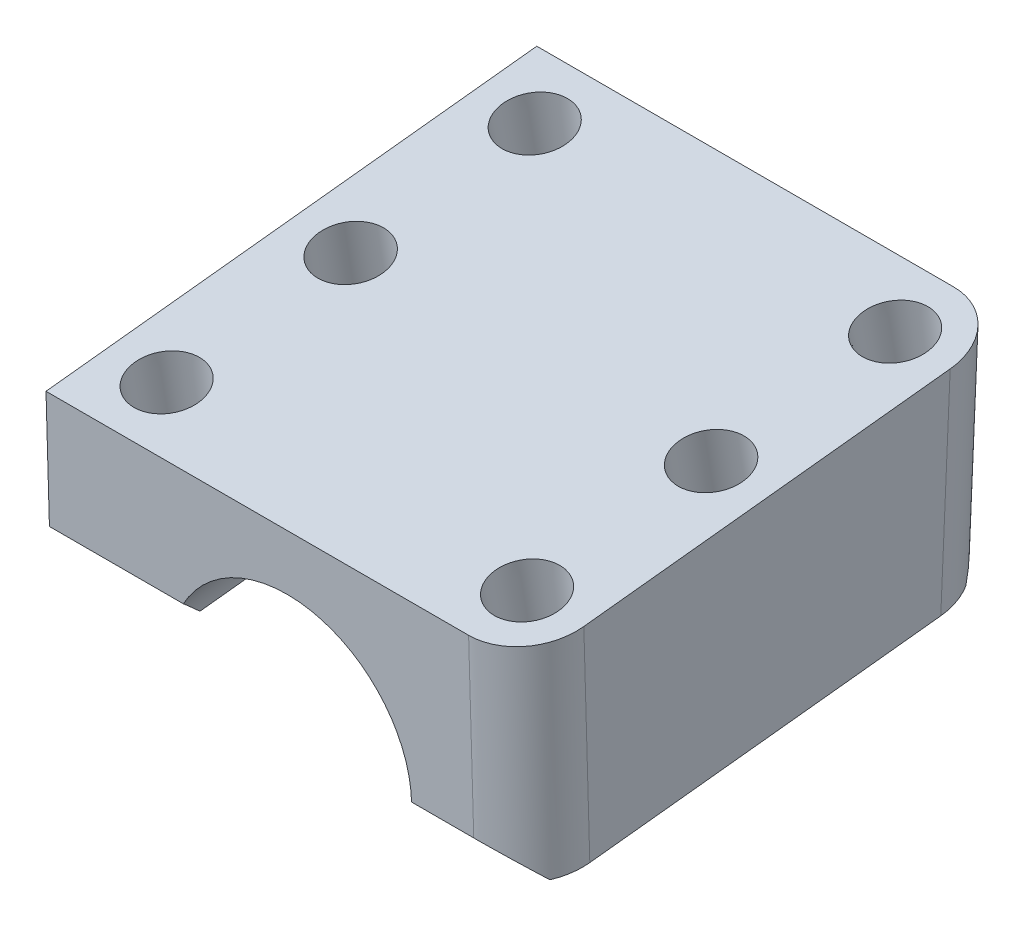
ISO-10303-21;
HEADER;
FILE_DESCRIPTION(('STEP AP214'),'2;1');
FILE_NAME('part.step','',(''),(''),'','','');
FILE_SCHEMA(('AUTOMOTIVE_DESIGN { 1 0 10303 214 1 1 1 1 }'));
ENDSEC;
DATA;
#1=APPLICATION_CONTEXT('core data for automotive mechanical design processes');
#2=APPLICATION_PROTOCOL_DEFINITION('international standard','automotive_design',2000,#1);
#3=PRODUCT_CONTEXT('',#1,'mechanical');
#4=PRODUCT('Part','Part','',(#3));
#5=PRODUCT_RELATED_PRODUCT_CATEGORY('part','',(#4));
#6=PRODUCT_DEFINITION_FORMATION('','',#4);
#7=PRODUCT_DEFINITION_CONTEXT('part definition',#1,'design');
#8=PRODUCT_DEFINITION('design','',#6,#7);
#9=PRODUCT_DEFINITION_SHAPE('','',#8);
#10=(LENGTH_UNIT() NAMED_UNIT(*) SI_UNIT(.MILLI.,.METRE.));
#11=(NAMED_UNIT(*) PLANE_ANGLE_UNIT() SI_UNIT($,.RADIAN.));
#12=(NAMED_UNIT(*) SI_UNIT($,.STERADIAN.) SOLID_ANGLE_UNIT());
#13=UNCERTAINTY_MEASURE_WITH_UNIT(LENGTH_MEASURE(1.E-05),#10,'distance_accuracy_value','');
#14=(GEOMETRIC_REPRESENTATION_CONTEXT(3) GLOBAL_UNCERTAINTY_ASSIGNED_CONTEXT((#13)) GLOBAL_UNIT_ASSIGNED_CONTEXT((#10,
#11,#12)) REPRESENTATION_CONTEXT('',''));
#15=CARTESIAN_POINT('',(0.,0.,0.));
#16=DIRECTION('',(0.,0.,1.));
#17=DIRECTION('',(1.,0.,0.));
#18=AXIS2_PLACEMENT_3D('',#15,#16,#17);
#19=CARTESIAN_POINT('',(188.153502405268,447.846631347327,1342.84881107068));
#20=DIRECTION('',(0.,0.0348994967025017,-0.999390827019096));
#21=DIRECTION('',(0.,0.999390827019096,0.0348994967025017));
#22=AXIS2_PLACEMENT_3D('',#19,#20,#21);
#23=PLANE('',#22);
#24=DIRECTION('',(0.00629717899452653,0.999371011669221,0.0348988047352322));
#25=VECTOR('',#24,1.);
#26=CARTESIAN_POINT('',(2706.7408835814,398347.018009544,15237.7940557248));
#27=LINE('',#26,#25);
#28=CARTESIAN_POINT('',(199.43978468566,434.867514734833,1342.39557033125));
#29=VERTEX_POINT('',#28);
#30=CARTESIAN_POINT('',(199.439949562137,434.893680859602,1342.39648407246));
#31=VERTEX_POINT('',#30);
#32=EDGE_CURVE('E168',#29,#31,#27,.T.);
#33=ORIENTED_EDGE('',*,*,#32,.F.);
#34=DIRECTION('',(1.,0.,0.));
#35=VECTOR('',#34,1.);
#36=CARTESIAN_POINT('',(188.153502405268,434.867514734738,1342.39557033124));
#37=LINE('',#36,#35);
#38=CARTESIAN_POINT('',(206.108243412971,434.867514734738,1342.39557033124));
#39=VERTEX_POINT('',#38);
#40=EDGE_CURVE('E59',#29,#39,#37,.T.);
#41=ORIENTED_EDGE('',*,*,#40,.T.);
#42=DIRECTION('',(-0.00629717899449076,-0.999371011669222,-0.0348988047352363));
#43=VECTOR('',#42,1.);
#44=CARTESIAN_POINT('',(206.189311445498,447.733123565572,1342.84484729159));
#45=LINE('',#44,#43);
#46=CARTESIAN_POINT('',(206.229361186729,454.089072862483,1343.0668019319));
#47=VERTEX_POINT('',#46);
#48=EDGE_CURVE('E166',#39,#47,#45,.F.);
#49=ORIENTED_EDGE('',*,*,#48,.T.);
#50=DIRECTION('',(1.,0.,0.));
#51=VECTOR('',#50,1.);
#52=CARTESIAN_POINT('',(-291599.140282778,454.089072858892,1343.06680193177));
#53=LINE('',#52,#51);
#54=CARTESIAN_POINT('',(160.905940247176,454.089072862483,1343.0668019319));
#55=VERTEX_POINT('',#54);
#56=EDGE_CURVE('E151',#55,#47,#53,.T.);
#57=ORIENTED_EDGE('',*,*,#56,.F.);
#58=DIRECTION('',(0.0062971789944939,0.999371011669221,0.0348988047352322));
#59=VECTOR('',#58,1.);
#60=CARTESIAN_POINT('',(2668.08745419803,398347.261273663,15237.802550695));
#61=LINE('',#60,#59);
#62=CARTESIAN_POINT('',(160.825140105862,441.265978735771,1342.61900961773));
#63=VERTEX_POINT('',#62);
#64=EDGE_CURVE('E143',#63,#55,#61,.T.);
#65=ORIENTED_EDGE('',*,*,#64,.F.);
#66=DIRECTION('',(1.,0.,0.));
#67=VECTOR('',#66,1.);
#68=CARTESIAN_POINT('',(188.153502405267,441.265978735739,1342.61900961772));
#69=LINE('',#68,#67);
#70=CARTESIAN_POINT('',(175.191164076687,441.265978735739,1342.61900961772));
#71=VERTEX_POINT('',#70);
#72=EDGE_CURVE('E268',#63,#71,#69,.T.);
#73=ORIENTED_EDGE('',*,*,#72,.T.);
#74=CARTESIAN_POINT('',(199.439949562144,434.893680859499,1342.39648407245));
#75=CARTESIAN_POINT('',(199.57085433581,455.668449403813,1343.12195497603));
#76=CARTESIAN_POINT('',(179.102540325545,458.234015619484,1343.21154652247));
#77=CARTESIAN_POINT('',(173.916193918006,438.092912859984,1342.50820371569));
#78=(BOUNDED_CURVE() B_SPLINE_CURVE(3,(#74,#75,#76,#77),.UNSPECIFIED.,.F.,
.F.) B_SPLINE_CURVE_WITH_KNOTS((4,4),(0.,1.),
.UNSPECIFIED.) CURVE() GEOMETRIC_REPRESENTATION_ITEM() RATIONAL_B_SPLINE_CURVE((1.,
0.415662889663478,0.415662889663478,1.)) REPRESENTATION_ITEM(''));
#79=EDGE_CURVE('E152',#31,#71,#78,.T.);
#80=ORIENTED_EDGE('',*,*,#79,.F.);
#81=EDGE_LOOP('',(#33,#41,#49,#57,#65,#73,#80));
#82=FACE_BOUND('',#81,.T.);
#83=ADVANCED_FACE('F49',(#82),#23,.F.);
#84=CARTESIAN_POINT('',(2712.09945337347,398364.6313612,15130.6226598834));
#85=DIRECTION('',(0.9987850922731,-0.00799153965599361,0.0486258649994229));
#86=DIRECTION('',(0.0486274178120887,0.,-0.99881698735901));
#87=AXIS2_PLACEMENT_3D('',#84,#85,#86);
#88=PLANE('',#87);
#89=DIRECTION('',(-0.0492781843518552,-0.16197493429726,0.985563687037212));
#90=VECTOR('',#89,1.);
#91=CARTESIAN_POINT('',(204.798519354205,452.507032516395,1235.22508823109));
#92=LINE('',#91,#90);
#93=CARTESIAN_POINT('',(201.847512364153,442.807219716647,1294.24522803215));
#94=VERTEX_POINT('',#93);
#95=EDGE_CURVE('E173',#94,#31,#92,.T.);
#96=ORIENTED_EDGE('',*,*,#95,.F.);
#97=DIRECTION('',(0.0348661114371685,0.811925398147656,-0.582719059338222));
#98=VECTOR('',#97,1.);
#99=CARTESIAN_POINT('',(-153.029055507488,-7821.18571742755,7225.31500574418));
#100=LINE('',#99,#98);
#101=CARTESIAN_POINT('',(201.690863815295,439.159352772088,1296.86330304179));
#102=VERTEX_POINT('',#101);
#103=EDGE_CURVE('E253',#94,#102,#100,.F.);
#104=ORIENTED_EDGE('',*,*,#103,.T.);
#105=DIRECTION('',(-0.0492781843518552,-0.16197493429726,0.985563687037212));
#106=VECTOR('',#105,1.);
#107=CARTESIAN_POINT('',(204.778360537992,449.307800515841,1235.11336858785));
#108=LINE('',#107,#106);
#109=CARTESIAN_POINT('',(199.559723392072,432.154400488027,1339.48611150627));
#110=VERTEX_POINT('',#109);
#111=EDGE_CURVE('E180',#102,#110,#108,.T.);
#112=ORIENTED_EDGE('',*,*,#111,.T.);
#113=DIRECTION('',(0.0301354248410263,-0.681688613421351,-0.731021539013268));
#114=VECTOR('',#113,1.);
#115=CARTESIAN_POINT('',(-65.4305993702451,6426.45800320402,7767.58973344807));
#116=LINE('',#115,#114);
#117=EDGE_CURVE('E251',#110,#29,#116,.F.);
#118=ORIENTED_EDGE('',*,*,#117,.T.);
#119=ORIENTED_EDGE('',*,*,#32,.T.);
#120=EDGE_LOOP('',(#96,#104,#112,#118,#119));
#121=FACE_BOUND('',#120,.T.);
#122=ADVANCED_FACE('F363',(#121),#88,.F.);
#123=CARTESIAN_POINT('',(-291593.781712988,449.307800513795,1235.11336858778));
#124=DIRECTION('',(0.,0.986762512438188,0.16217195826244));
#125=DIRECTION('',(0.,-0.16217195826244,0.986762512438188));
#126=AXIS2_PLACEMENT_3D('',#123,#124,#125);
#127=PLANE('',#126);
#128=CARTESIAN_POINT('',(207.171814898282,436.277443763342,1314.39876234358));
#129=DIRECTION('',(0.,0.986762512438188,0.16217195826244));
#130=DIRECTION('',(0.,-0.16217195826244,0.986762512438188));
#131=AXIS2_PLACEMENT_3D('',#128,#129,#130);
#132=CIRCLE('',#131,3.57123999999999);
#133=CARTESIAN_POINT('',(207.171814898282,435.698288779116,1317.9227280985));
#134=VERTEX_POINT('',#133);
#135=EDGE_CURVE('E275',#134,#134,#132,.T.);
#136=ORIENTED_EDGE('',*,*,#135,.T.);
#137=EDGE_LOOP('',(#136));
#138=FACE_BOUND('',#137,.T.);
#139=ORIENTED_EDGE('',*,*,#111,.F.);
#140=DIRECTION('',(1.,0.,0.));
#141=VECTOR('',#140,1.);
#142=CARTESIAN_POINT('',(-291593.781712988,439.159352770022,1296.86330304184));
#143=LINE('',#142,#141);
#144=CARTESIAN_POINT('',(213.355307167909,439.159352772008,1296.86330304178));
#145=VERTEX_POINT('',#144);
#146=EDGE_CURVE('E229',#102,#145,#143,.T.);
#147=ORIENTED_EDGE('',*,*,#146,.T.);
#148=CARTESIAN_POINT('',(207.885709069241,438.623978299233,1300.12087892302));
#149=DIRECTION('',(0.,0.986762512438188,0.16217195826244));
#150=DIRECTION('',(0.0492781843518903,0.16197493429726,-0.98556368703721));
#151=AXIS2_PLACEMENT_3D('',#148,#149,#150);
#152=ELLIPSE('',#151,6.47658087237328,6.3499999999873);
#153=CARTESIAN_POINT('',(214.227994405167,438.573232022413,1300.42965316577));
#154=VERTEX_POINT('',#153);
#155=EDGE_CURVE('E220',#145,#154,#152,.F.);
#156=ORIENTED_EDGE('',*,*,#155,.T.);
#157=DIRECTION('',(-0.0492781843518552,-0.16197493429726,0.985563687037212));
#158=VECTOR('',#157,1.);
#159=CARTESIAN_POINT('',(217.493808634063,449.307800515753,1235.11336858785));
#160=LINE('',#159,#158);
#161=CARTESIAN_POINT('',(212.435680776481,432.681986513574,1336.2759257395));
#162=VERTEX_POINT('',#161);
#163=EDGE_CURVE('E184',#154,#162,#160,.T.);
#164=ORIENTED_EDGE('',*,*,#163,.T.);
#165=CARTESIAN_POINT('',(206.093395440554,432.732732790384,1335.96715149676));
#166=DIRECTION('',(0.,0.986762512438188,0.16217195826244));
#167=DIRECTION('',(-0.0492781843519099,-0.16197493429726,0.985563687037209));
#168=AXIS2_PLACEMENT_3D('',#165,#166,#167);
#169=ELLIPSE('',#168,6.4024910931593,6.3499999999873);
#170=CARTESIAN_POINT('',(211.364354549108,432.154400487937,1339.48611150625));
#171=VERTEX_POINT('',#170);
#172=EDGE_CURVE('E216',#162,#171,#169,.F.);
#173=ORIENTED_EDGE('',*,*,#172,.T.);
#174=DIRECTION('',(-1.,0.,0.));
#175=VECTOR('',#174,1.);
#176=CARTESIAN_POINT('',(-291593.781712988,432.154400486134,1339.48611150527));
#177=LINE('',#176,#175);
#178=EDGE_CURVE('E225',#171,#110,#177,.T.);
#179=ORIENTED_EDGE('',*,*,#178,.T.);
#180=EDGE_LOOP('',(#139,#147,#156,#164,#173,#179));
#181=FACE_BOUND('',#180,.T.);
#182=ADVANCED_FACE('F373',(#138,#181),#127,.F.);
#183=CARTESIAN_POINT('',(2724.81439723117,398364.551340122,15130.6198654858));
#184=DIRECTION('',(-0.9987850922731,0.00799153965595826,-0.0486258649994288));
#185=DIRECTION('',(-0.0486274178120945,0.,0.99881698735901));
#186=AXIS2_PLACEMENT_3D('',#183,#184,#185);
#187=PLANE('',#186);
#188=ORIENTED_EDGE('',*,*,#163,.F.);
#189=DIRECTION('',(0.00969501307586259,0.999343857905187,-0.0348978565049001));
#190=VECTOR('',#189,1.);
#191=CARTESIAN_POINT('',(4065.1509648208,397384.527573447,-12561.2285190726));
#192=LINE('',#191,#190);
#193=CARTESIAN_POINT('',(214.447761282021,461.226391625247,1299.63858740102));
#194=VERTEX_POINT('',#193);
#195=EDGE_CURVE('E201',#154,#194,#192,.T.);
#196=ORIENTED_EDGE('',*,*,#195,.T.);
#197=DIRECTION('',(-0.0492781843518552,-0.16197493429726,0.985563687037212));
#198=VECTOR('',#197,1.);
#199=CARTESIAN_POINT('',(217.634920347545,471.70242451938,1235.89540609053));
#200=LINE('',#199,#198);
#201=CARTESIAN_POINT('',(212.576792489963,455.0766105172,1337.05796324219));
#202=VERTEX_POINT('',#201);
#203=EDGE_CURVE('E164',#194,#202,#200,.T.);
#204=ORIENTED_EDGE('',*,*,#203,.T.);
#205=DIRECTION('',(-0.00629717899449076,-0.999371011669222,-0.0348988047352363));
#206=VECTOR('',#205,1.);
#207=CARTESIAN_POINT('',(2719.83886793492,398361.034032001,15232.2401817513));
#208=LINE('',#207,#206);
#209=EDGE_CURVE('E197',#202,#162,#208,.T.);
#210=ORIENTED_EDGE('',*,*,#209,.T.);
#211=EDGE_LOOP('',(#188,#196,#204,#210));
#212=FACE_BOUND('',#211,.T.);
#213=ADVANCED_FACE('F378',(#212),#187,.F.);
#214=CARTESIAN_POINT('',(-291593.781712986,471.702424515685,1235.8954060904));
#215=DIRECTION('',(0.,-0.986762512438188,-0.162171958262439));
#216=DIRECTION('',(0.,0.162171958262439,-0.986762512438188));
#217=AXIS2_PLACEMENT_3D('',#214,#215,#216);
#218=PLANE('',#217);
#219=CARTESIAN_POINT('',(206.231923605184,455.118864797624,1336.80085997796));
#220=DIRECTION('',(0.,0.986762512438194,0.162171958262407));
#221=DIRECTION('',(0.,-0.162171958262407,0.986762512438194));
#222=AXIS2_PLACEMENT_3D('',#219,#220,#221);
#223=CIRCLE('',#222,3.556);
#224=CARTESIAN_POINT('',(206.231923605184,454.542181314043,1340.30978747219));
#225=VERTEX_POINT('',#224);
#226=EDGE_CURVE('E307',#225,#225,#223,.T.);
#227=ORIENTED_EDGE('',*,*,#226,.F.);
#228=EDGE_LOOP('',(#227));
#229=FACE_BOUND('',#228,.T.);
#230=CARTESIAN_POINT('',(208.11170619138,461.297616407426,1299.20520825404));
#231=DIRECTION('',(0.,0.986762512438194,0.162171958262407));
#232=DIRECTION('',(0.,-0.162171958262407,0.986762512438194));
#233=AXIS2_PLACEMENT_3D('',#230,#231,#232);
#234=CIRCLE('',#233,3.556);
#235=CARTESIAN_POINT('',(208.11170619138,460.720932923845,1302.71413574827));
#236=VERTEX_POINT('',#235);
#237=EDGE_CURVE('E302',#236,#236,#234,.T.);
#238=ORIENTED_EDGE('',*,*,#237,.F.);
#239=EDGE_LOOP('',(#238));
#240=FACE_BOUND('',#239,.T.);
#241=CARTESIAN_POINT('',(169.456743979095,461.297616407401,1299.20520825404));
#242=DIRECTION('',(0.,0.986762512438194,0.162171958262407));
#243=DIRECTION('',(0.,-0.162171958262407,0.986762512438194));
#244=AXIS2_PLACEMENT_3D('',#241,#242,#243);
#245=CIRCLE('',#244,3.556);
#246=CARTESIAN_POINT('',(169.456743979095,460.720932923819,1302.71413574827));
#247=VERTEX_POINT('',#246);
#248=EDGE_CURVE('E297',#247,#247,#245,.T.);
#249=ORIENTED_EDGE('',*,*,#248,.F.);
#250=EDGE_LOOP('',(#249));
#251=FACE_BOUND('',#250,.T.);
#252=CARTESIAN_POINT('',(167.5769613929,455.1188647976,1336.80085997794));
#253=DIRECTION('',(0.,0.986762512438194,0.162171958262407));
#254=DIRECTION('',(0.,-0.162171958262407,0.986762512438194));
#255=AXIS2_PLACEMENT_3D('',#252,#253,#254);
#256=CIRCLE('',#255,3.556);
#257=CARTESIAN_POINT('',(167.5769613929,454.542181314019,1340.30978747217));
#258=VERTEX_POINT('',#257);
#259=EDGE_CURVE('E289',#258,#258,#256,.T.);
#260=ORIENTED_EDGE('',*,*,#259,.F.);
#261=EDGE_LOOP('',(#260));
#262=FACE_BOUND('',#261,.T.);
#263=CARTESIAN_POINT('',(207.171814898282,458.208240602525,1318.003034116));
#264=DIRECTION('',(0.,0.986762512438194,0.162171958262407));
#265=DIRECTION('',(0.,-0.162171958262407,0.986762512438194));
#266=AXIS2_PLACEMENT_3D('',#263,#264,#265);
#267=CIRCLE('',#266,3.57123999999998);
#268=CARTESIAN_POINT('',(207.171814898282,457.6290856183,1321.52699987092));
#269=VERTEX_POINT('',#268);
#270=EDGE_CURVE('E283',#269,#269,#267,.T.);
#271=ORIENTED_EDGE('',*,*,#270,.F.);
#272=EDGE_LOOP('',(#271));
#273=FACE_BOUND('',#272,.T.);
#274=CARTESIAN_POINT('',(168.516852685998,458.2082406025,1318.00303411599));
#275=DIRECTION('',(0.,0.986762512438194,0.162171958262407));
#276=DIRECTION('',(0.,-0.162171958262407,0.986762512438194));
#277=AXIS2_PLACEMENT_3D('',#274,#275,#276);
#278=CIRCLE('',#277,3.57123999999998);
#279=CARTESIAN_POINT('',(168.516852685998,457.629085618275,1321.52699987091));
#280=VERTEX_POINT('',#279);
#281=EDGE_CURVE('E272',#280,#280,#278,.T.);
#282=ORIENTED_EDGE('',*,*,#281,.F.);
#283=EDGE_LOOP('',(#282));
#284=FACE_BOUND('',#283,.T.);
#285=ORIENTED_EDGE('',*,*,#203,.F.);
#286=CARTESIAN_POINT('',(208.105475946098,461.277137901959,1299.32981315828));
#287=DIRECTION('',(0.,-0.986762512438188,-0.162171958262439));
#288=DIRECTION('',(0.049278184351918,0.16197493429726,-0.985563687037209));
#289=AXIS2_PLACEMENT_3D('',#286,#287,#288);
#290=ELLIPSE('',#289,6.47658087237328,6.3499999999873);
#291=CARTESIAN_POINT('',(208.117814957234,462.327408342216,1292.93926630004));
#292=VERTEX_POINT('',#291);
#293=EDGE_CURVE('E209',#194,#292,#290,.F.);
#294=ORIENTED_EDGE('',*,*,#293,.T.);
#295=DIRECTION('',(-1.,0.,0.));
#296=VECTOR('',#295,1.);
#297=CARTESIAN_POINT('',(-291593.781712986,462.327408338583,1292.93926630016));
#298=LINE('',#297,#296);
#299=CARTESIAN_POINT('',(163.412317028763,462.327408342215,1292.93926630004));
#300=VERTEX_POINT('',#299);
#301=EDGE_CURVE('E160',#292,#300,#298,.T.);
#302=ORIENTED_EDGE('',*,*,#301,.T.);
#303=DIRECTION('',(-0.0492781843518552,-0.16197493429726,0.985563687037212));
#304=VECTOR('',#303,1.);
#305=CARTESIAN_POINT('',(166.264510039244,471.702424519276,1235.89540609053));
#306=LINE('',#305,#304);
#307=EDGE_CURVE('E147',#300,#55,#306,.T.);
#308=ORIENTED_EDGE('',*,*,#307,.T.);
#309=ORIENTED_EDGE('',*,*,#56,.T.);
#310=CARTESIAN_POINT('',(206.234507154039,455.127356793867,1336.74918899944));
#311=DIRECTION('',(0.,-0.986762512438188,-0.162171958262439));
#312=DIRECTION('',(-0.049278184351953,-0.16197493429726,0.985563687037207));
#313=AXIS2_PLACEMENT_3D('',#310,#311,#312);
#314=ELLIPSE('',#313,6.4024910931593,6.3499999999873);
#315=EDGE_CURVE('E206',#47,#202,#314,.F.);
#316=ORIENTED_EDGE('',*,*,#315,.T.);
#317=EDGE_LOOP('',(#285,#294,#302,#308,#309,#316));
#318=FACE_BOUND('',#317,.T.);
#319=ADVANCED_FACE('F157',(#229,#240,#251,#262,#273,#284,#318),#218,.F.);
#320=CARTESIAN_POINT('',(2673.4460239901,398364.87462532,15130.6311548536));
#321=DIRECTION('',(0.9987850922731,-0.00799153965596118,0.0486258649994283));
#322=DIRECTION('',(0.048627417812094,0.,-0.99881698735901));
#323=AXIS2_PLACEMENT_3D('',#320,#321,#322);
#324=PLANE('',#323);
#325=DIRECTION('',(-0.0096950130758655,-0.999343857905187,0.0348978565049001));
#326=VECTOR('',#325,1.);
#327=CARTESIAN_POINT('',(4014.10568367019,397384.614621019,-12567.8924315908));
#328=LINE('',#327,#326);
#329=CARTESIAN_POINT('',(163.294605313921,450.193904413368,1293.36297759387));
#330=VERTEX_POINT('',#329);
#331=EDGE_CURVE('E280',#300,#330,#328,.T.);
#332=ORIENTED_EDGE('',*,*,#331,.T.);
#333=DIRECTION('',(0.0348661114371461,0.811925398147641,-0.582719059338243));
#334=VECTOR('',#333,1.);
#335=CARTESIAN_POINT('',(-191.574312774037,-7813.62089260494,7224.30490409364));
#336=LINE('',#335,#334);
#337=CARTESIAN_POINT('',(163.098692139318,445.631684087198,1296.63728425187));
#338=VERTEX_POINT('',#337);
#339=EDGE_CURVE('E265',#330,#338,#336,.F.);
#340=ORIENTED_EDGE('',*,*,#339,.T.);
#341=DIRECTION('',(-0.0492781843518552,-0.16197493429726,0.985563687037212));
#342=VECTOR('',#341,1.);
#343=CARTESIAN_POINT('',(166.163715958195,455.706264516893,1235.33680787433));
#344=LINE('',#343,#342);
#345=CARTESIAN_POINT('',(160.945078812274,438.552864489078,1339.70955079276));
#346=VERTEX_POINT('',#345);
#347=EDGE_CURVE('E163',#338,#346,#344,.T.);
#348=ORIENTED_EDGE('',*,*,#347,.T.);
#349=DIRECTION('',(0.0301354248410528,-0.681688613421342,-0.731021539013275));
#350=VECTOR('',#349,1.);
#351=CARTESIAN_POINT('',(-104.010176299596,6432.06320750161,7766.96250584983));
#352=LINE('',#351,#350);
#353=EDGE_CURVE('E73',#346,#63,#352,.F.);
#354=ORIENTED_EDGE('',*,*,#353,.T.);
#355=ORIENTED_EDGE('',*,*,#64,.T.);
#356=ORIENTED_EDGE('',*,*,#307,.F.);
#357=EDGE_LOOP('',(#332,#340,#348,#354,#355,#356));
#358=FACE_BOUND('',#357,.T.);
#359=ADVANCED_FACE('F146',(#358),#324,.F.);
#360=CARTESIAN_POINT('',(-291593.781713008,455.706264529057,1235.33680787476));
#361=DIRECTION('',(0.,0.986762512438188,0.162171958262442));
#362=DIRECTION('',(0.,-0.162171958262442,0.986762512438188));
#363=AXIS2_PLACEMENT_3D('',#360,#361,#362);
#364=PLANE('',#363);
#365=CARTESIAN_POINT('',(168.516852685998,442.54338571734,1315.42855427854));
#366=DIRECTION('',(0.,0.986762512438188,0.162171958262442));
#367=DIRECTION('',(0.,-0.162171958262442,0.986762512438188));
#368=AXIS2_PLACEMENT_3D('',#365,#366,#367);
#369=CIRCLE('',#368,3.57123999999999);
#370=CARTESIAN_POINT('',(168.516852685998,441.964230733115,1318.95252003346));
#371=VERTEX_POINT('',#370);
#372=EDGE_CURVE('E274',#371,#371,#369,.T.);
#373=ORIENTED_EDGE('',*,*,#372,.T.);
#374=EDGE_LOOP('',(#373));
#375=FACE_BOUND('',#374,.T.);
#376=ORIENTED_EDGE('',*,*,#347,.F.);
#377=DIRECTION('',(1.,0.,0.));
#378=VECTOR('',#377,1.);
#379=CARTESIAN_POINT('',(-291593.781713008,445.631684099508,1296.63728425141));
#380=LINE('',#379,#378);
#381=CARTESIAN_POINT('',(176.209739891182,445.631684087064,1296.63728425185));
#382=VERTEX_POINT('',#381);
#383=EDGE_CURVE('E259',#338,#382,#380,.T.);
#384=ORIENTED_EDGE('',*,*,#383,.T.);
#385=DIRECTION('',(-0.0492781843518552,-0.16197493429726,0.985563687037212));
#386=VECTOR('',#385,1.);
#387=CARTESIAN_POINT('',(179.274763710057,455.706264516755,1235.33680787433));
#388=LINE('',#387,#386);
#389=CARTESIAN_POINT('',(174.056126564138,438.552864488944,1339.70955079273));
#390=VERTEX_POINT('',#389);
#391=EDGE_CURVE('E193',#382,#390,#388,.T.);
#392=ORIENTED_EDGE('',*,*,#391,.T.);
#393=DIRECTION('',(-1.,0.,0.));
#394=VECTOR('',#393,1.);
#395=CARTESIAN_POINT('',(-291593.781713008,438.552864501396,1339.70955079225));
#396=LINE('',#395,#394);
#397=EDGE_CURVE('E256',#390,#346,#396,.T.);
#398=ORIENTED_EDGE('',*,*,#397,.T.);
#399=EDGE_LOOP('',(#376,#384,#392,#398));
#400=FACE_BOUND('',#399,.T.);
#401=ADVANCED_FACE('F346',(#375,#400),#364,.F.);
#402=CARTESIAN_POINT('',(191.860257268907,452.610554920995,1234.59518877587));
#403=DIRECTION('',(-0.0492781843518552,-0.16197493429726,0.985563687037212));
#404=DIRECTION('',(0.,-0.986762512438188,-0.16217195826244));
#405=AXIS2_PLACEMENT_3D('',#402,#403,#404);
#406=CYLINDRICAL_SURFACE('',#405,12.954);
#407=CARTESIAN_POINT('',(188.90915057421,442.910414397052,1293.61732266982));
#408=DIRECTION('',(0.,0.0348994967025001,0.999390827019096));
#409=DIRECTION('',(-0.243513121730909,-0.96930676719431,0.0338489381839829));
#410=AXIS2_PLACEMENT_3D('',#407,#408,#409);
#411=ELLIPSE('',#410,13.2276744387897,12.954);
#412=CARTESIAN_POINT('',(178.161887792097,450.193904413193,1293.36297759387));
#413=VERTEX_POINT('',#412);
#414=CARTESIAN_POINT('',(201.862278345367,443.721573098132,1293.5889963838));
#415=VERTEX_POINT('',#414);
#416=EDGE_CURVE('E202',#413,#415,#411,.F.);
#417=ORIENTED_EDGE('',*,*,#416,.T.);
#418=CARTESIAN_POINT('',(188.877755306089,442.807219716526,1294.24522803223));
#419=DIRECTION('',(0.,0.583073572560038,0.812419355371396));
#420=DIRECTION('',(-0.0696054150959355,-0.810448914942627,0.581659386976296));
#421=AXIS2_PLACEMENT_3D('',#418,#419,#420);
#422=ELLIPSE('',#421,18.3420063322007,12.954);
#423=EDGE_CURVE('E248',#415,#94,#422,.F.);
#424=ORIENTED_EDGE('',*,*,#423,.T.);
#425=ORIENTED_EDGE('',*,*,#95,.T.);
#426=ORIENTED_EDGE('',*,*,#79,.T.);
#427=CARTESIAN_POINT('',(186.75121172611,435.817377026949,1336.77609963183));
#428=DIRECTION('',(0.,0.731353701619225,-0.68199836006244));
#429=DIRECTION('',(-0.0804784667817551,0.679786194412039,0.728981444394339));
#430=AXIS2_PLACEMENT_3D('',#427,#428,#429);
#431=ELLIPSE('',#430,16.3847383239867,12.954);
#432=EDGE_CURVE('E242',#71,#390,#431,.F.);
#433=ORIENTED_EDGE('',*,*,#432,.T.);
#434=ORIENTED_EDGE('',*,*,#391,.F.);
#435=CARTESIAN_POINT('',(188.627248744634,441.98381714262,1299.25535926133));
#436=DIRECTION('',(0.,0.583073572560058,0.812419355371382));
#437=DIRECTION('',(-0.069605415095961,-0.810448914942611,0.581659386976316));
#438=AXIS2_PLACEMENT_3D('',#435,#436,#437);
#439=ELLIPSE('',#438,18.3420063322012,12.954);
#440=EDGE_CURVE('E245',#382,#413,#439,.F.);
#441=ORIENTED_EDGE('',*,*,#440,.T.);
#442=EDGE_LOOP('',(#417,#424,#425,#426,#433,#434,#441));
#443=FACE_BOUND('',#442,.T.);
#444=ADVANCED_FACE('F339',(#443),#406,.F.);
#445=CARTESIAN_POINT('',(0.,45.6585451563162,1307.48966362574));
#446=DIRECTION('',(0.,0.0348994967025001,0.999390827019096));
#447=DIRECTION('',(0.,-0.999390827019096,0.0348994967025001));
#448=AXIS2_PLACEMENT_3D('',#445,#446,#447);
#449=PLANE('',#448);
#450=DIRECTION('',(0.0096950130758626,0.999343857905187,-0.0348978565049001));
#451=VECTOR('',#450,1.);
#452=CARTESIAN_POINT('',(204.056370851581,43.681328192647,1307.55870956356));
#453=LINE('',#452,#451);
#454=CARTESIAN_POINT('',(207.937312706129,443.721573098133,1293.5889963838));
#455=VERTEX_POINT('',#454);
#456=EDGE_CURVE('E212',#292,#455,#453,.F.);
#457=ORIENTED_EDGE('',*,*,#456,.T.);
#458=DIRECTION('',(-1.,0.,0.));
#459=VECTOR('',#458,1.);
#460=CARTESIAN_POINT('',(-2.70596932997917E-12,443.721573098131,1293.5889963838));
#461=LINE('',#460,#459);
#462=EDGE_CURVE('E239',#455,#415,#461,.T.);
#463=ORIENTED_EDGE('',*,*,#462,.T.);
#464=ORIENTED_EDGE('',*,*,#416,.F.);
#465=DIRECTION('',(-1.,0.,0.));
#466=VECTOR('',#465,1.);
#467=CARTESIAN_POINT('',(1.72743240266894E-11,450.193904413201,1293.36297759387));
#468=LINE('',#467,#466);
#469=EDGE_CURVE('E236',#413,#330,#468,.T.);
#470=ORIENTED_EDGE('',*,*,#469,.T.);
#471=ORIENTED_EDGE('',*,*,#331,.F.);
#472=ORIENTED_EDGE('',*,*,#301,.F.);
#473=EDGE_LOOP('',(#457,#463,#464,#470,#471,#472));
#474=FACE_BOUND('',#473,.T.);
#475=ADVANCED_FACE('F355',(#474),#449,.F.);
#476=CARTESIAN_POINT('',(168.516852685998,458.2082406025,1318.00303411599));
#477=DIRECTION('',(0.,0.986762512438194,0.162171958262407));
#478=DIRECTION('',(0.,-0.162171958262407,0.986762512438194));
#479=AXIS2_PLACEMENT_3D('',#476,#477,#478);
#480=CYLINDRICAL_SURFACE('',#479,3.57123999999999);
#481=ORIENTED_EDGE('',*,*,#281,.T.);
#482=EDGE_LOOP('',(#481));
#483=FACE_BOUND('',#482,.T.);
#484=ORIENTED_EDGE('',*,*,#372,.F.);
#485=EDGE_LOOP('',(#484));
#486=FACE_BOUND('',#485,.T.);
#487=ADVANCED_FACE('F415',(#483,#486),#480,.F.);
#488=CARTESIAN_POINT('',(207.171814898282,458.208240602525,1318.003034116));
#489=DIRECTION('',(0.,0.986762512438194,0.162171958262407));
#490=DIRECTION('',(0.,-0.162171958262407,0.986762512438194));
#491=AXIS2_PLACEMENT_3D('',#488,#489,#490);
#492=CYLINDRICAL_SURFACE('',#491,3.57123999999999);
#493=ORIENTED_EDGE('',*,*,#270,.T.);
#494=EDGE_LOOP('',(#493));
#495=FACE_BOUND('',#494,.T.);
#496=ORIENTED_EDGE('',*,*,#135,.F.);
#497=EDGE_LOOP('',(#496));
#498=FACE_BOUND('',#497,.T.);
#499=ADVANCED_FACE('F418',(#495,#498),#492,.F.);
#500=CARTESIAN_POINT('',(167.5769613929,445.719951866626,1335.25617207549));
#501=DIRECTION('',(0.,-0.986762512438194,-0.162171958262407));
#502=DIRECTION('',(0.,0.162171958262407,-0.986762512438194));
#503=AXIS2_PLACEMENT_3D('',#500,#501,#502);
#504=PLANE('',#503);
#505=CARTESIAN_POINT('',(167.5769613929,445.719951866626,1335.25617207549));
#506=DIRECTION('',(0.,0.986762512438194,0.162171958262407));
#507=DIRECTION('',(0.,-0.162171958262407,0.986762512438194));
#508=AXIS2_PLACEMENT_3D('',#505,#506,#507);
#509=CIRCLE('',#508,3.16230000000001);
#510=CARTESIAN_POINT('',(167.5769613929,445.207115483013,1338.37661116858));
#511=VERTEX_POINT('',#510);
#512=EDGE_CURVE('E291',#511,#511,#509,.T.);
#513=ORIENTED_EDGE('',*,*,#512,.T.);
#514=EDGE_LOOP('',(#513));
#515=FACE_BOUND('',#514,.T.);
#516=ADVANCED_FACE('F422',(#515),#504,.F.);
#517=CARTESIAN_POINT('',(167.5769613929,455.1188647976,1336.80085997794));
#518=DIRECTION('',(0.,0.986762512438194,0.162171958262407));
#519=DIRECTION('',(0.,-0.162171958262407,0.986762512438194));
#520=AXIS2_PLACEMENT_3D('',#517,#518,#519);
#521=CONICAL_SURFACE('',#520,3.556,0.0413098188646277);
#522=ORIENTED_EDGE('',*,*,#512,.F.);
#523=EDGE_LOOP('',(#522));
#524=FACE_BOUND('',#523,.T.);
#525=ORIENTED_EDGE('',*,*,#259,.T.);
#526=EDGE_LOOP('',(#525));
#527=FACE_BOUND('',#526,.T.);
#528=ADVANCED_FACE('F429',(#524,#527),#521,.F.);
#529=CARTESIAN_POINT('',(169.456743979095,451.898703476427,1297.66052035159));
#530=DIRECTION('',(0.,-0.986762512438194,-0.162171958262407));
#531=DIRECTION('',(0.,0.162171958262407,-0.986762512438194));
#532=AXIS2_PLACEMENT_3D('',#529,#530,#531);
#533=PLANE('',#532);
#534=CARTESIAN_POINT('',(169.456743979095,451.898703476427,1297.66052035159));
#535=DIRECTION('',(0.,0.986762512438194,0.162171958262407));
#536=DIRECTION('',(0.,-0.162171958262407,0.986762512438194));
#537=AXIS2_PLACEMENT_3D('',#534,#535,#536);
#538=CIRCLE('',#537,3.16230000000001);
#539=CARTESIAN_POINT('',(169.456743979095,451.385867092814,1300.78095944467));
#540=VERTEX_POINT('',#539);
#541=EDGE_CURVE('E292',#540,#540,#538,.T.);
#542=ORIENTED_EDGE('',*,*,#541,.T.);
#543=EDGE_LOOP('',(#542));
#544=FACE_BOUND('',#543,.T.);
#545=ADVANCED_FACE('F433',(#544),#533,.F.);
#546=CARTESIAN_POINT('',(169.456743979095,461.297616407401,1299.20520825404));
#547=DIRECTION('',(0.,0.986762512438194,0.162171958262407));
#548=DIRECTION('',(0.,-0.162171958262407,0.986762512438194));
#549=AXIS2_PLACEMENT_3D('',#546,#547,#548);
#550=CONICAL_SURFACE('',#549,3.556,0.0413098188646277);
#551=ORIENTED_EDGE('',*,*,#541,.F.);
#552=EDGE_LOOP('',(#551));
#553=FACE_BOUND('',#552,.T.);
#554=ORIENTED_EDGE('',*,*,#248,.T.);
#555=EDGE_LOOP('',(#554));
#556=FACE_BOUND('',#555,.T.);
#557=ADVANCED_FACE('F437',(#553,#556),#550,.F.);
#558=CARTESIAN_POINT('',(208.11170619138,451.898703476453,1297.66052035159));
#559=DIRECTION('',(0.,-0.986762512438194,-0.162171958262407));
#560=DIRECTION('',(0.,0.162171958262407,-0.986762512438194));
#561=AXIS2_PLACEMENT_3D('',#558,#559,#560);
#562=PLANE('',#561);
#563=CARTESIAN_POINT('',(208.11170619138,451.898703476453,1297.66052035159));
#564=DIRECTION('',(0.,0.986762512438194,0.162171958262407));
#565=DIRECTION('',(0.,-0.162171958262407,0.986762512438194));
#566=AXIS2_PLACEMENT_3D('',#563,#564,#565);
#567=CIRCLE('',#566,3.16230000000001);
#568=CARTESIAN_POINT('',(208.11170619138,451.385867092839,1300.78095944468));
#569=VERTEX_POINT('',#568);
#570=EDGE_CURVE('E299',#569,#569,#567,.T.);
#571=ORIENTED_EDGE('',*,*,#570,.T.);
#572=EDGE_LOOP('',(#571));
#573=FACE_BOUND('',#572,.T.);
#574=ADVANCED_FACE('F441',(#573),#562,.F.);
#575=CARTESIAN_POINT('',(208.11170619138,461.297616407426,1299.20520825404));
#576=DIRECTION('',(0.,0.986762512438194,0.162171958262407));
#577=DIRECTION('',(0.,-0.162171958262407,0.986762512438194));
#578=AXIS2_PLACEMENT_3D('',#575,#576,#577);
#579=CONICAL_SURFACE('',#578,3.556,0.0413098188646277);
#580=ORIENTED_EDGE('',*,*,#570,.F.);
#581=EDGE_LOOP('',(#580));
#582=FACE_BOUND('',#581,.T.);
#583=ORIENTED_EDGE('',*,*,#237,.T.);
#584=EDGE_LOOP('',(#583));
#585=FACE_BOUND('',#584,.T.);
#586=ADVANCED_FACE('F445',(#582,#585),#579,.F.);
#587=CARTESIAN_POINT('',(206.231923605184,445.71995186665,1335.25617207551));
#588=DIRECTION('',(0.,-0.986762512438194,-0.162171958262407));
#589=DIRECTION('',(0.,0.162171958262407,-0.986762512438194));
#590=AXIS2_PLACEMENT_3D('',#587,#588,#589);
#591=PLANE('',#590);
#592=CARTESIAN_POINT('',(206.231923605184,445.71995186665,1335.25617207551));
#593=DIRECTION('',(0.,0.986762512438194,0.162171958262407));
#594=DIRECTION('',(0.,-0.162171958262407,0.986762512438194));
#595=AXIS2_PLACEMENT_3D('',#592,#593,#594);
#596=CIRCLE('',#595,3.16230000000001);
#597=CARTESIAN_POINT('',(206.231923605184,445.207115483037,1338.37661116859));
#598=VERTEX_POINT('',#597);
#599=EDGE_CURVE('E304',#598,#598,#596,.T.);
#600=ORIENTED_EDGE('',*,*,#599,.T.);
#601=EDGE_LOOP('',(#600));
#602=FACE_BOUND('',#601,.T.);
#603=ADVANCED_FACE('F388',(#602),#591,.F.);
#604=CARTESIAN_POINT('',(206.231923605184,455.118864797624,1336.80085997796));
#605=DIRECTION('',(0.,0.986762512438194,0.162171958262407));
#606=DIRECTION('',(0.,-0.162171958262407,0.986762512438194));
#607=AXIS2_PLACEMENT_3D('',#604,#605,#606);
#608=CONICAL_SURFACE('',#607,3.556,0.0413098188646277);
#609=ORIENTED_EDGE('',*,*,#599,.F.);
#610=EDGE_LOOP('',(#609));
#611=FACE_BOUND('',#610,.T.);
#612=ORIENTED_EDGE('',*,*,#226,.T.);
#613=EDGE_LOOP('',(#612));
#614=FACE_BOUND('',#613,.T.);
#615=ADVANCED_FACE('F382',(#611,#614),#608,.F.);
#616=CARTESIAN_POINT('',(4058.80867948488,397384.578319723,-12561.5372933153));
#617=DIRECTION('',(0.00969501307586259,0.999343857905187,-0.0348978565049001));
#618=DIRECTION('',(0.,0.0348994967025001,0.999390827019096));
#619=AXIS2_PLACEMENT_3D('',#616,#617,#618);
#620=CYLINDRICAL_SURFACE('',#619,6.3499999999873);
#621=ORIENTED_EDGE('',*,*,#155,.F.);
#622=CARTESIAN_POINT('',(207.844882805999,434.415683262102,1300.26783582397));
#623=DIRECTION('',(0.,0.583073572560038,0.812419355371396));
#624=DIRECTION('',(0.0116485888319837,0.812364235063992,-0.583034012701762));
#625=AXIS2_PLACEMENT_3D('',#622,#623,#624);
#626=ELLIPSE('',#625,11.4550781575981,6.3499999999873);
#627=EDGE_CURVE('E233',#145,#455,#626,.T.);
#628=ORIENTED_EDGE('',*,*,#627,.T.);
#629=ORIENTED_EDGE('',*,*,#456,.F.);
#630=ORIENTED_EDGE('',*,*,#293,.F.);
#631=ORIENTED_EDGE('',*,*,#195,.F.);
#632=EDGE_LOOP('',(#621,#628,#629,#630,#631));
#633=FACE_BOUND('',#632,.T.);
#634=ADVANCED_FACE('F380',(#633),#620,.T.);
#635=CARTESIAN_POINT('',(2713.496582599,398361.084778278,15231.9314075085));
#636=DIRECTION('',(-0.00629717899449076,-0.999371011669221,-0.0348988047352363));
#637=DIRECTION('',(0.,0.0348994967025017,-0.999390827019096));
#638=AXIS2_PLACEMENT_3D('',#635,#636,#637);
#639=CYLINDRICAL_SURFACE('',#638,6.3499999999873);
#640=ORIENTED_EDGE('',*,*,#48,.F.);
#641=CARTESIAN_POINT('',(206.068255533499,428.742994787285,1335.82782677562));
#642=DIRECTION('',(0.,0.731353701619216,-0.681998360062449));
#643=DIRECTION('',(-0.00890537937143336,-0.681971316319709,-0.7313247007557));
#644=AXIS2_PLACEMENT_3D('',#641,#642,#643);
#645=ELLIPSE('',#644,8.98043417996457,6.3499999999873);
#646=EDGE_CURVE('E11',#39,#171,#645,.T.);
#647=ORIENTED_EDGE('',*,*,#646,.T.);
#648=ORIENTED_EDGE('',*,*,#172,.F.);
#649=ORIENTED_EDGE('',*,*,#209,.F.);
#650=ORIENTED_EDGE('',*,*,#315,.F.);
#651=EDGE_LOOP('',(#640,#647,#648,#649,#650));
#652=FACE_BOUND('',#651,.T.);
#653=ADVANCED_FACE('F370',(#652),#639,.T.);
#654=CARTESIAN_POINT('',(-291593.781712988,439.159352770022,1296.86330304184));
#655=DIRECTION('',(0.,0.583073572560038,0.812419355371396));
#656=DIRECTION('',(1.,0.,0.));
#657=AXIS2_PLACEMENT_3D('',#654,#655,#656);
#658=PLANE('',#657);
#659=ORIENTED_EDGE('',*,*,#423,.F.);
#660=ORIENTED_EDGE('',*,*,#462,.F.);
#661=ORIENTED_EDGE('',*,*,#627,.F.);
#662=ORIENTED_EDGE('',*,*,#146,.F.);
#663=ORIENTED_EDGE('',*,*,#103,.F.);
#664=EDGE_LOOP('',(#659,#660,#661,#662,#663));
#665=FACE_BOUND('',#664,.T.);
#666=ADVANCED_FACE('F359',(#665),#658,.F.);
#667=CARTESIAN_POINT('',(-291593.781713008,445.631684099508,1296.63728425141));
#668=DIRECTION('',(0.,0.583073572560058,0.812419355371382));
#669=DIRECTION('',(1.,0.,0.));
#670=AXIS2_PLACEMENT_3D('',#667,#668,#669);
#671=PLANE('',#670);
#672=ORIENTED_EDGE('',*,*,#339,.F.);
#673=ORIENTED_EDGE('',*,*,#469,.F.);
#674=ORIENTED_EDGE('',*,*,#440,.F.);
#675=ORIENTED_EDGE('',*,*,#383,.F.);
#676=EDGE_LOOP('',(#672,#673,#674,#675));
#677=FACE_BOUND('',#676,.T.);
#678=ADVANCED_FACE('F351',(#677),#671,.F.);
#679=CARTESIAN_POINT('',(-291593.781712988,432.154400486134,1339.48611150527));
#680=DIRECTION('',(0.,0.731353701619216,-0.681998360062449));
#681=DIRECTION('',(-1.,0.,0.));
#682=AXIS2_PLACEMENT_3D('',#679,#680,#681);
#683=PLANE('',#682);
#684=ORIENTED_EDGE('',*,*,#646,.F.);
#685=ORIENTED_EDGE('',*,*,#40,.F.);
#686=ORIENTED_EDGE('',*,*,#117,.F.);
#687=ORIENTED_EDGE('',*,*,#178,.F.);
#688=EDGE_LOOP('',(#684,#685,#686,#687));
#689=FACE_BOUND('',#688,.T.);
#690=ADVANCED_FACE('F367',(#689),#683,.F.);
#691=CARTESIAN_POINT('',(-291593.781713008,438.552864501396,1339.70955079225));
#692=DIRECTION('',(0.,0.731353701619225,-0.68199836006244));
#693=DIRECTION('',(-1.,0.,0.));
#694=AXIS2_PLACEMENT_3D('',#691,#692,#693);
#695=PLANE('',#694);
#696=ORIENTED_EDGE('',*,*,#432,.F.);
#697=ORIENTED_EDGE('',*,*,#72,.F.);
#698=ORIENTED_EDGE('',*,*,#353,.F.);
#699=ORIENTED_EDGE('',*,*,#397,.F.);
#700=EDGE_LOOP('',(#696,#697,#698,#699));
#701=FACE_BOUND('',#700,.T.);
#702=ADVANCED_FACE('F52',(#701),#695,.F.);
#703=CLOSED_SHELL('',(#83,#122,#182,#213,#319,#359,#401,#444,#475,#487,#499,#516,#528,#545,#557,
#574,#586,#603,#615,#634,#653,#666,#678,#690,#702));
#704=MANIFOLD_SOLID_BREP('B2',#703);
#705=ADVANCED_BREP_SHAPE_REPRESENTATION('',(#18,#704),#14);
#706=SHAPE_DEFINITION_REPRESENTATION(#9,#705);
ENDSEC;
END-ISO-10303-21;
